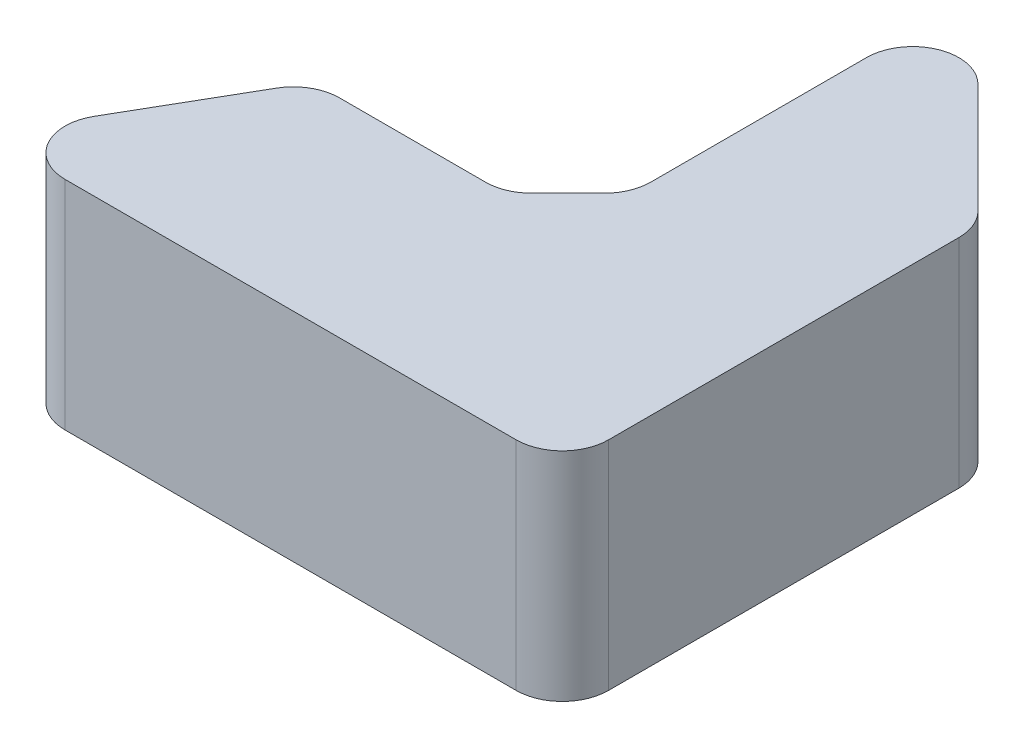
ISO-10303-21;
HEADER;
FILE_DESCRIPTION(('STEP AP214'),'2;1');
FILE_NAME('part.step','',(''),(''),'','','');
FILE_SCHEMA(('AUTOMOTIVE_DESIGN { 1 0 10303 214 1 1 1 1 }'));
ENDSEC;
DATA;
#1=APPLICATION_CONTEXT('core data for automotive mechanical design processes');
#2=APPLICATION_PROTOCOL_DEFINITION('international standard','automotive_design',2000,#1);
#3=PRODUCT_CONTEXT('',#1,'mechanical');
#4=PRODUCT('Part','Part','',(#3));
#5=PRODUCT_RELATED_PRODUCT_CATEGORY('part','',(#4));
#6=PRODUCT_DEFINITION_FORMATION('','',#4);
#7=PRODUCT_DEFINITION_CONTEXT('part definition',#1,'design');
#8=PRODUCT_DEFINITION('design','',#6,#7);
#9=PRODUCT_DEFINITION_SHAPE('','',#8);
#10=(LENGTH_UNIT() NAMED_UNIT(*) SI_UNIT(.MILLI.,.METRE.));
#11=(NAMED_UNIT(*) PLANE_ANGLE_UNIT() SI_UNIT($,.RADIAN.));
#12=(NAMED_UNIT(*) SI_UNIT($,.STERADIAN.) SOLID_ANGLE_UNIT());
#13=UNCERTAINTY_MEASURE_WITH_UNIT(LENGTH_MEASURE(1.E-05),#10,'distance_accuracy_value','');
#14=(GEOMETRIC_REPRESENTATION_CONTEXT(3) GLOBAL_UNCERTAINTY_ASSIGNED_CONTEXT((#13)) GLOBAL_UNIT_ASSIGNED_CONTEXT((#10,
#11,#12)) REPRESENTATION_CONTEXT('',''));
#15=CARTESIAN_POINT('',(0.,0.,0.));
#16=DIRECTION('',(0.,0.,1.));
#17=DIRECTION('',(1.,0.,0.));
#18=AXIS2_PLACEMENT_3D('',#15,#16,#17);
#19=CARTESIAN_POINT('',(10.3923048454134,18.8,-18.));
#20=DIRECTION('',(0.866025403784436,0.,0.500000000000004));
#21=DIRECTION('',(0.500000000000004,0.,-0.866025403784436));
#22=AXIS2_PLACEMENT_3D('',#19,#20,#21);
#23=PLANE('',#22);
#24=DIRECTION('',(-0.500000000000004,0.,0.866025403784436));
#25=VECTOR('',#24,1.);
#26=CARTESIAN_POINT('',(10.3923048454134,18.8,-18.));
#27=LINE('',#26,#25);
#28=CARTESIAN_POINT('',(9.23760430703412,18.8,-16.));
#29=VERTEX_POINT('',#28);
#30=CARTESIAN_POINT('',(3.4641016151378,18.8,-6.00000000000002));
#31=VERTEX_POINT('',#30);
#32=EDGE_CURVE('E192',#29,#31,#27,.T.);
#33=ORIENTED_EDGE('',*,*,#32,.F.);
#34=DIRECTION('',(0.,-1.,0.));
#35=VECTOR('',#34,1.);
#36=CARTESIAN_POINT('',(9.23760430703412,18.8,-16.));
#37=LINE('',#36,#35);
#38=CARTESIAN_POINT('',(9.23760430703412,0.,-16.));
#39=VERTEX_POINT('',#38);
#40=EDGE_CURVE('E256',#29,#39,#37,.T.);
#41=ORIENTED_EDGE('',*,*,#40,.T.);
#42=DIRECTION('',(-0.500000000000004,0.,0.866025403784436));
#43=VECTOR('',#42,1.);
#44=CARTESIAN_POINT('',(10.3923048454134,0.,-18.));
#45=LINE('',#44,#43);
#46=CARTESIAN_POINT('',(3.4641016151378,0.,-6.00000000000002));
#47=VERTEX_POINT('',#46);
#48=EDGE_CURVE('E178',#39,#47,#45,.T.);
#49=ORIENTED_EDGE('',*,*,#48,.T.);
#50=DIRECTION('',(0.,-1.,0.));
#51=VECTOR('',#50,1.);
#52=CARTESIAN_POINT('',(3.4641016151378,18.8,-6.00000000000001));
#53=LINE('',#52,#51);
#54=EDGE_CURVE('E253',#47,#31,#53,.F.);
#55=ORIENTED_EDGE('',*,*,#54,.T.);
#56=EDGE_LOOP('',(#33,#41,#49,#55));
#57=FACE_BOUND('',#56,.T.);
#58=ADVANCED_FACE('F39',(#57),#23,.F.);
#59=CARTESIAN_POINT('',(0.,18.8,0.));
#60=DIRECTION('',(0.,0.,-1.));
#61=DIRECTION('',(-1.,0.,0.));
#62=AXIS2_PLACEMENT_3D('',#59,#60,#61);
#63=PLANE('',#62);
#64=DIRECTION('',(1.,0.,0.));
#65=VECTOR('',#64,1.);
#66=CARTESIAN_POINT('',(0.,0.,0.));
#67=LINE('',#66,#65);
#68=CARTESIAN_POINT('',(6.92820323027555,0.,0.));
#69=VERTEX_POINT('',#68);
#70=CARTESIAN_POINT('',(46.,0.,0.));
#71=VERTEX_POINT('',#70);
#72=EDGE_CURVE('E171',#69,#71,#67,.T.);
#73=ORIENTED_EDGE('',*,*,#72,.T.);
#74=DIRECTION('',(0.,-1.,0.));
#75=VECTOR('',#74,1.);
#76=CARTESIAN_POINT('',(46.,18.8,0.));
#77=LINE('',#76,#75);
#78=CARTESIAN_POINT('',(46.,18.8,0.));
#79=VERTEX_POINT('',#78);
#80=EDGE_CURVE('E146',#71,#79,#77,.F.);
#81=ORIENTED_EDGE('',*,*,#80,.T.);
#82=DIRECTION('',(1.,0.,0.));
#83=VECTOR('',#82,1.);
#84=CARTESIAN_POINT('',(0.,18.8,0.));
#85=LINE('',#84,#83);
#86=CARTESIAN_POINT('',(6.92820323027555,18.8,0.));
#87=VERTEX_POINT('',#86);
#88=EDGE_CURVE('E299',#87,#79,#85,.T.);
#89=ORIENTED_EDGE('',*,*,#88,.F.);
#90=DIRECTION('',(0.,-1.,0.));
#91=VECTOR('',#90,1.);
#92=CARTESIAN_POINT('',(6.92820323027555,18.8,0.));
#93=LINE('',#92,#91);
#94=EDGE_CURVE('E152',#87,#69,#93,.T.);
#95=ORIENTED_EDGE('',*,*,#94,.T.);
#96=EDGE_LOOP('',(#73,#81,#89,#95));
#97=FACE_BOUND('',#96,.T.);
#98=ADVANCED_FACE('F301',(#97),#63,.F.);
#99=CARTESIAN_POINT('',(50.,18.8,0.));
#100=DIRECTION('',(-1.,0.,0.));
#101=DIRECTION('',(0.,0.,1.));
#102=AXIS2_PLACEMENT_3D('',#99,#100,#101);
#103=PLANE('',#102);
#104=DIRECTION('',(0.,0.,-1.));
#105=VECTOR('',#104,1.);
#106=CARTESIAN_POINT('',(50.,18.8,0.));
#107=LINE('',#106,#105);
#108=CARTESIAN_POINT('',(50.,18.8,-4.));
#109=VERTEX_POINT('',#108);
#110=CARTESIAN_POINT('',(50.,18.8,-34.3431457505076));
#111=VERTEX_POINT('',#110);
#112=EDGE_CURVE('E162',#109,#111,#107,.T.);
#113=ORIENTED_EDGE('',*,*,#112,.F.);
#114=DIRECTION('',(0.,-1.,0.));
#115=VECTOR('',#114,1.);
#116=CARTESIAN_POINT('',(50.,18.8,-4.));
#117=LINE('',#116,#115);
#118=CARTESIAN_POINT('',(50.,0.,-4.));
#119=VERTEX_POINT('',#118);
#120=EDGE_CURVE('E145',#109,#119,#117,.T.);
#121=ORIENTED_EDGE('',*,*,#120,.T.);
#122=DIRECTION('',(0.,0.,-1.));
#123=VECTOR('',#122,1.);
#124=CARTESIAN_POINT('',(50.,0.,0.));
#125=LINE('',#124,#123);
#126=CARTESIAN_POINT('',(50.,0.,-34.3431457505076));
#127=VERTEX_POINT('',#126);
#128=EDGE_CURVE('E159',#119,#127,#125,.T.);
#129=ORIENTED_EDGE('',*,*,#128,.T.);
#130=DIRECTION('',(0.,-1.,0.));
#131=VECTOR('',#130,1.);
#132=CARTESIAN_POINT('',(50.,18.8,-34.3431457505076));
#133=LINE('',#132,#131);
#134=EDGE_CURVE('E165',#127,#111,#133,.F.);
#135=ORIENTED_EDGE('',*,*,#134,.T.);
#136=EDGE_LOOP('',(#113,#121,#129,#135));
#137=FACE_BOUND('',#136,.T.);
#138=ADVANCED_FACE('F158',(#137),#103,.F.);
#139=CARTESIAN_POINT('',(50.,18.8,-36.));
#140=DIRECTION('',(-0.707106781186546,0.,0.707106781186549));
#141=DIRECTION('',(0.707106781186549,0.,0.707106781186546));
#142=AXIS2_PLACEMENT_3D('',#139,#140,#141);
#143=PLANE('',#142);
#144=DIRECTION('',(-0.707106781186549,0.,-0.707106781186546));
#145=VECTOR('',#144,1.);
#146=CARTESIAN_POINT('',(50.,18.8,-36.));
#147=LINE('',#146,#145);
#148=CARTESIAN_POINT('',(48.8284271247462,18.8,-37.1715728752538));
#149=VERTEX_POINT('',#148);
#150=CARTESIAN_POINT('',(39.3284271247462,18.8,-46.6715728752538));
#151=VERTEX_POINT('',#150);
#152=EDGE_CURVE('E306',#149,#151,#147,.T.);
#153=ORIENTED_EDGE('',*,*,#152,.F.);
#154=DIRECTION('',(0.,-1.,0.));
#155=VECTOR('',#154,1.);
#156=CARTESIAN_POINT('',(48.8284271247462,18.8,-37.1715728752538));
#157=LINE('',#156,#155);
#158=CARTESIAN_POINT('',(48.8284271247462,0.,-37.1715728752538));
#159=VERTEX_POINT('',#158);
#160=EDGE_CURVE('E229',#149,#159,#157,.T.);
#161=ORIENTED_EDGE('',*,*,#160,.T.);
#162=DIRECTION('',(-0.707106781186549,0.,-0.707106781186546));
#163=VECTOR('',#162,1.);
#164=CARTESIAN_POINT('',(50.,0.,-36.));
#165=LINE('',#164,#163);
#166=CARTESIAN_POINT('',(39.3284271247462,0.,-46.6715728752538));
#167=VERTEX_POINT('',#166);
#168=EDGE_CURVE('E170',#159,#167,#165,.T.);
#169=ORIENTED_EDGE('',*,*,#168,.T.);
#170=DIRECTION('',(0.,-1.,0.));
#171=VECTOR('',#170,1.);
#172=CARTESIAN_POINT('',(39.3284271247462,18.8,-46.6715728752538));
#173=LINE('',#172,#171);
#174=EDGE_CURVE('E226',#167,#151,#173,.F.);
#175=ORIENTED_EDGE('',*,*,#174,.T.);
#176=EDGE_LOOP('',(#153,#161,#169,#175));
#177=FACE_BOUND('',#176,.T.);
#178=ADVANCED_FACE('F329',(#177),#143,.F.);
#179=CARTESIAN_POINT('',(32.5,18.8,-53.4999999999999));
#180=DIRECTION('',(1.,0.,0.));
#181=DIRECTION('',(0.,0.,-1.));
#182=AXIS2_PLACEMENT_3D('',#179,#180,#181);
#183=PLANE('',#182);
#184=DIRECTION('',(0.,0.,1.));
#185=VECTOR('',#184,1.);
#186=CARTESIAN_POINT('',(32.5,18.8,-53.4999999999999));
#187=LINE('',#186,#185);
#188=CARTESIAN_POINT('',(32.5,18.8,-43.8431457505076));
#189=VERTEX_POINT('',#188);
#190=CARTESIAN_POINT('',(32.5,18.8,-25.1568542494923));
#191=VERTEX_POINT('',#190);
#192=EDGE_CURVE('E282',#189,#191,#187,.T.);
#193=ORIENTED_EDGE('',*,*,#192,.F.);
#194=DIRECTION('',(0.,-1.,0.));
#195=VECTOR('',#194,1.);
#196=CARTESIAN_POINT('',(32.5,18.8,-43.8431457505076));
#197=LINE('',#196,#195);
#198=CARTESIAN_POINT('',(32.5,0.,-43.8431457505076));
#199=VERTEX_POINT('',#198);
#200=EDGE_CURVE('E236',#189,#199,#197,.T.);
#201=ORIENTED_EDGE('',*,*,#200,.T.);
#202=DIRECTION('',(0.,0.,1.));
#203=VECTOR('',#202,1.);
#204=CARTESIAN_POINT('',(32.5,0.,-53.4999999999999));
#205=LINE('',#204,#203);
#206=CARTESIAN_POINT('',(32.5,0.,-25.1568542494923));
#207=VERTEX_POINT('',#206);
#208=EDGE_CURVE('E176',#199,#207,#205,.T.);
#209=ORIENTED_EDGE('',*,*,#208,.T.);
#210=DIRECTION('',(0.,-1.,0.));
#211=VECTOR('',#210,1.);
#212=CARTESIAN_POINT('',(32.5,18.8,-25.1568542494923));
#213=LINE('',#212,#211);
#214=EDGE_CURVE('E233',#207,#191,#213,.F.);
#215=ORIENTED_EDGE('',*,*,#214,.T.);
#216=EDGE_LOOP('',(#193,#201,#209,#215));
#217=FACE_BOUND('',#216,.T.);
#218=ADVANCED_FACE('F323',(#217),#183,.F.);
#219=CARTESIAN_POINT('',(32.5,18.8,-23.4999999999999));
#220=DIRECTION('',(0.707106781186549,0.,0.707106781186546));
#221=DIRECTION('',(0.707106781186546,0.,-0.707106781186549));
#222=AXIS2_PLACEMENT_3D('',#219,#220,#221);
#223=PLANE('',#222);
#224=DIRECTION('',(-0.707106781186546,0.,0.707106781186549));
#225=VECTOR('',#224,1.);
#226=CARTESIAN_POINT('',(32.5,18.8,-23.4999999999999));
#227=LINE('',#226,#225);
#228=CARTESIAN_POINT('',(31.3284271247462,18.8,-22.3284271247461));
#229=VERTEX_POINT('',#228);
#230=CARTESIAN_POINT('',(28.1715728752539,18.8,-19.1715728752538));
#231=VERTEX_POINT('',#230);
#232=EDGE_CURVE('E279',#229,#231,#227,.T.);
#233=ORIENTED_EDGE('',*,*,#232,.F.);
#234=DIRECTION('',(0.,-1.,0.));
#235=VECTOR('',#234,1.);
#236=CARTESIAN_POINT('',(31.3284271247462,0.,-22.3284271247461));
#237=LINE('',#236,#235);
#238=CARTESIAN_POINT('',(31.3284271247462,0.,-22.3284271247461));
#239=VERTEX_POINT('',#238);
#240=EDGE_CURVE('E243',#229,#239,#237,.T.);
#241=ORIENTED_EDGE('',*,*,#240,.T.);
#242=DIRECTION('',(-0.707106781186546,0.,0.707106781186549));
#243=VECTOR('',#242,1.);
#244=CARTESIAN_POINT('',(32.5,0.,-23.4999999999999));
#245=LINE('',#244,#243);
#246=CARTESIAN_POINT('',(28.1715728752539,0.,-19.1715728752538));
#247=VERTEX_POINT('',#246);
#248=EDGE_CURVE('E185',#239,#247,#245,.T.);
#249=ORIENTED_EDGE('',*,*,#248,.T.);
#250=DIRECTION('',(0.,-1.,0.));
#251=VECTOR('',#250,1.);
#252=CARTESIAN_POINT('',(28.1715728752539,18.8,-19.1715728752538));
#253=LINE('',#252,#251);
#254=EDGE_CURVE('E240',#247,#231,#253,.F.);
#255=ORIENTED_EDGE('',*,*,#254,.T.);
#256=EDGE_LOOP('',(#233,#241,#249,#255));
#257=FACE_BOUND('',#256,.T.);
#258=ADVANCED_FACE('F273',(#257),#223,.F.);
#259=CARTESIAN_POINT('',(27.0000000000001,18.8,-18.));
#260=DIRECTION('',(0.,0.,1.));
#261=DIRECTION('',(1.,0.,0.));
#262=AXIS2_PLACEMENT_3D('',#259,#260,#261);
#263=PLANE('',#262);
#264=DIRECTION('',(-1.,0.,0.));
#265=VECTOR('',#264,1.);
#266=CARTESIAN_POINT('',(27.0000000000001,18.8,-18.));
#267=LINE('',#266,#265);
#268=CARTESIAN_POINT('',(25.3431457505077,18.8,-18.));
#269=VERTEX_POINT('',#268);
#270=CARTESIAN_POINT('',(12.7017059221719,18.8,-18.));
#271=VERTEX_POINT('',#270);
#272=EDGE_CURVE('E194',#269,#271,#267,.T.);
#273=ORIENTED_EDGE('',*,*,#272,.F.);
#274=DIRECTION('',(0.,-1.,0.));
#275=VECTOR('',#274,1.);
#276=CARTESIAN_POINT('',(25.3431457505077,0.,-18.));
#277=LINE('',#276,#275);
#278=CARTESIAN_POINT('',(25.3431457505077,0.,-18.));
#279=VERTEX_POINT('',#278);
#280=EDGE_CURVE('E249',#269,#279,#277,.T.);
#281=ORIENTED_EDGE('',*,*,#280,.T.);
#282=DIRECTION('',(-1.,0.,0.));
#283=VECTOR('',#282,1.);
#284=CARTESIAN_POINT('',(27.0000000000001,0.,-18.));
#285=LINE('',#284,#283);
#286=CARTESIAN_POINT('',(12.7017059221719,0.,-18.));
#287=VERTEX_POINT('',#286);
#288=EDGE_CURVE('E189',#279,#287,#285,.T.);
#289=ORIENTED_EDGE('',*,*,#288,.T.);
#290=DIRECTION('',(0.,-1.,0.));
#291=VECTOR('',#290,1.);
#292=CARTESIAN_POINT('',(12.7017059221719,18.8,-18.));
#293=LINE('',#292,#291);
#294=EDGE_CURVE('E55',#287,#271,#293,.F.);
#295=ORIENTED_EDGE('',*,*,#294,.T.);
#296=EDGE_LOOP('',(#273,#281,#289,#295));
#297=FACE_BOUND('',#296,.T.);
#298=ADVANCED_FACE('F276',(#297),#263,.F.);
#299=CARTESIAN_POINT('',(0.,18.8,0.));
#300=DIRECTION('',(0.,-1.,0.));
#301=DIRECTION('',(0.,0.,-1.));
#302=AXIS2_PLACEMENT_3D('',#299,#300,#301);
#303=PLANE('',#302);
#304=ORIENTED_EDGE('',*,*,#88,.T.);
#305=CARTESIAN_POINT('',(46.,18.8,-4.));
#306=DIRECTION('',(0.,-1.,0.));
#307=DIRECTION('',(0.,0.,-1.));
#308=AXIS2_PLACEMENT_3D('',#305,#306,#307);
#309=CIRCLE('',#308,4.);
#310=EDGE_CURVE('E223',#79,#109,#309,.F.);
#311=ORIENTED_EDGE('',*,*,#310,.T.);
#312=ORIENTED_EDGE('',*,*,#112,.T.);
#313=CARTESIAN_POINT('',(46.,18.8,-34.3431457505076));
#314=DIRECTION('',(0.,-1.,0.));
#315=DIRECTION('',(0.,0.,-1.));
#316=AXIS2_PLACEMENT_3D('',#313,#314,#315);
#317=CIRCLE('',#316,4.);
#318=EDGE_CURVE('E220',#111,#149,#317,.F.);
#319=ORIENTED_EDGE('',*,*,#318,.T.);
#320=ORIENTED_EDGE('',*,*,#152,.T.);
#321=CARTESIAN_POINT('',(36.5,18.8,-43.8431457505076));
#322=DIRECTION('',(0.,-1.,0.));
#323=DIRECTION('',(0.,0.,-1.));
#324=AXIS2_PLACEMENT_3D('',#321,#322,#323);
#325=CIRCLE('',#324,4.);
#326=EDGE_CURVE('E217',#151,#189,#325,.F.);
#327=ORIENTED_EDGE('',*,*,#326,.T.);
#328=ORIENTED_EDGE('',*,*,#192,.T.);
#329=CARTESIAN_POINT('',(28.5,18.8,-25.1568542494923));
#330=DIRECTION('',(0.,-1.,0.));
#331=DIRECTION('',(0.,0.,-1.));
#332=AXIS2_PLACEMENT_3D('',#329,#330,#331);
#333=CIRCLE('',#332,4.);
#334=EDGE_CURVE('E263',#191,#229,#333,.T.);
#335=ORIENTED_EDGE('',*,*,#334,.T.);
#336=ORIENTED_EDGE('',*,*,#232,.T.);
#337=CARTESIAN_POINT('',(25.3431457505077,18.8,-22.));
#338=DIRECTION('',(0.,-1.,0.));
#339=DIRECTION('',(0.,0.,-1.));
#340=AXIS2_PLACEMENT_3D('',#337,#338,#339);
#341=CIRCLE('',#340,4.);
#342=EDGE_CURVE('E11',#231,#269,#341,.T.);
#343=ORIENTED_EDGE('',*,*,#342,.T.);
#344=ORIENTED_EDGE('',*,*,#272,.T.);
#345=CARTESIAN_POINT('',(12.7017059221719,18.8,-14.));
#346=DIRECTION('',(0.,-1.,0.));
#347=DIRECTION('',(0.,0.,-1.));
#348=AXIS2_PLACEMENT_3D('',#345,#346,#347);
#349=CIRCLE('',#348,4.);
#350=EDGE_CURVE('E214',#271,#29,#349,.F.);
#351=ORIENTED_EDGE('',*,*,#350,.T.);
#352=ORIENTED_EDGE('',*,*,#32,.T.);
#353=CARTESIAN_POINT('',(6.92820323027555,18.8,-4.));
#354=DIRECTION('',(0.,-1.,0.));
#355=DIRECTION('',(0.,0.,-1.));
#356=AXIS2_PLACEMENT_3D('',#353,#354,#355);
#357=CIRCLE('',#356,4.);
#358=EDGE_CURVE('E211',#31,#87,#357,.F.);
#359=ORIENTED_EDGE('',*,*,#358,.T.);
#360=EDGE_LOOP('',(#304,#311,#312,#319,#320,#327,#328,#335,#336,#343,#344,#351,#352,#359));
#361=FACE_BOUND('',#360,.T.);
#362=ADVANCED_FACE('F298',(#361),#303,.F.);
#363=CARTESIAN_POINT('',(0.,0.,0.));
#364=DIRECTION('',(0.,-1.,0.));
#365=DIRECTION('',(0.,0.,-1.));
#366=AXIS2_PLACEMENT_3D('',#363,#364,#365);
#367=PLANE('',#366);
#368=ORIENTED_EDGE('',*,*,#128,.F.);
#369=CARTESIAN_POINT('',(46.,0.,-4.));
#370=DIRECTION('',(0.,-1.,0.));
#371=DIRECTION('',(0.,0.,-1.));
#372=AXIS2_PLACEMENT_3D('',#369,#370,#371);
#373=CIRCLE('',#372,4.);
#374=EDGE_CURVE('E141',#119,#71,#373,.T.);
#375=ORIENTED_EDGE('',*,*,#374,.T.);
#376=ORIENTED_EDGE('',*,*,#72,.F.);
#377=CARTESIAN_POINT('',(6.92820323027555,0.,-4.));
#378=DIRECTION('',(0.,-1.,0.));
#379=DIRECTION('',(0.,0.,-1.));
#380=AXIS2_PLACEMENT_3D('',#377,#378,#379);
#381=CIRCLE('',#380,4.);
#382=EDGE_CURVE('E164',#69,#47,#381,.T.);
#383=ORIENTED_EDGE('',*,*,#382,.T.);
#384=ORIENTED_EDGE('',*,*,#48,.F.);
#385=CARTESIAN_POINT('',(12.7017059221719,0.,-14.));
#386=DIRECTION('',(0.,-1.,0.));
#387=DIRECTION('',(0.,0.,-1.));
#388=AXIS2_PLACEMENT_3D('',#385,#386,#387);
#389=CIRCLE('',#388,4.);
#390=EDGE_CURVE('E198',#39,#287,#389,.T.);
#391=ORIENTED_EDGE('',*,*,#390,.T.);
#392=ORIENTED_EDGE('',*,*,#288,.F.);
#393=CARTESIAN_POINT('',(25.3431457505077,0.,-22.));
#394=DIRECTION('',(0.,-1.,0.));
#395=DIRECTION('',(0.,0.,-1.));
#396=AXIS2_PLACEMENT_3D('',#393,#394,#395);
#397=CIRCLE('',#396,4.);
#398=EDGE_CURVE('E48',#279,#247,#397,.F.);
#399=ORIENTED_EDGE('',*,*,#398,.T.);
#400=ORIENTED_EDGE('',*,*,#248,.F.);
#401=CARTESIAN_POINT('',(28.5,0.,-25.1568542494923));
#402=DIRECTION('',(0.,-1.,0.));
#403=DIRECTION('',(0.,0.,-1.));
#404=AXIS2_PLACEMENT_3D('',#401,#402,#403);
#405=CIRCLE('',#404,4.);
#406=EDGE_CURVE('E260',#239,#207,#405,.F.);
#407=ORIENTED_EDGE('',*,*,#406,.T.);
#408=ORIENTED_EDGE('',*,*,#208,.F.);
#409=CARTESIAN_POINT('',(36.5,0.,-43.8431457505076));
#410=DIRECTION('',(0.,-1.,0.));
#411=DIRECTION('',(0.,0.,-1.));
#412=AXIS2_PLACEMENT_3D('',#409,#410,#411);
#413=CIRCLE('',#412,4.);
#414=EDGE_CURVE('E201',#199,#167,#413,.T.);
#415=ORIENTED_EDGE('',*,*,#414,.T.);
#416=ORIENTED_EDGE('',*,*,#168,.F.);
#417=CARTESIAN_POINT('',(46.,0.,-34.3431457505076));
#418=DIRECTION('',(0.,-1.,0.));
#419=DIRECTION('',(0.,0.,-1.));
#420=AXIS2_PLACEMENT_3D('',#417,#418,#419);
#421=CIRCLE('',#420,4.);
#422=EDGE_CURVE('E153',#159,#127,#421,.T.);
#423=ORIENTED_EDGE('',*,*,#422,.T.);
#424=EDGE_LOOP('',(#368,#375,#376,#383,#384,#391,#392,#399,#400,#407,#408,#415,#416,#423));
#425=FACE_BOUND('',#424,.T.);
#426=ADVANCED_FACE('F167',(#425),#367,.T.);
#427=CARTESIAN_POINT('',(46.,18.8,-4.));
#428=DIRECTION('',(0.,-1.,0.));
#429=DIRECTION('',(0.,0.,-1.));
#430=AXIS2_PLACEMENT_3D('',#427,#428,#429);
#431=CYLINDRICAL_SURFACE('',#430,4.);
#432=ORIENTED_EDGE('',*,*,#310,.F.);
#433=ORIENTED_EDGE('',*,*,#80,.F.);
#434=ORIENTED_EDGE('',*,*,#374,.F.);
#435=ORIENTED_EDGE('',*,*,#120,.F.);
#436=EDGE_LOOP('',(#432,#433,#434,#435));
#437=FACE_BOUND('',#436,.T.);
#438=ADVANCED_FACE('F144',(#437),#431,.T.);
#439=CARTESIAN_POINT('',(46.,18.8,-34.3431457505076));
#440=DIRECTION('',(0.,-1.,0.));
#441=DIRECTION('',(0.,0.,-1.));
#442=AXIS2_PLACEMENT_3D('',#439,#440,#441);
#443=CYLINDRICAL_SURFACE('',#442,4.);
#444=ORIENTED_EDGE('',*,*,#318,.F.);
#445=ORIENTED_EDGE('',*,*,#134,.F.);
#446=ORIENTED_EDGE('',*,*,#422,.F.);
#447=ORIENTED_EDGE('',*,*,#160,.F.);
#448=EDGE_LOOP('',(#444,#445,#446,#447));
#449=FACE_BOUND('',#448,.T.);
#450=ADVANCED_FACE('F333',(#449),#443,.T.);
#451=CARTESIAN_POINT('',(36.5,18.8,-43.8431457505076));
#452=DIRECTION('',(0.,-1.,0.));
#453=DIRECTION('',(0.,0.,-1.));
#454=AXIS2_PLACEMENT_3D('',#451,#452,#453);
#455=CYLINDRICAL_SURFACE('',#454,4.);
#456=ORIENTED_EDGE('',*,*,#326,.F.);
#457=ORIENTED_EDGE('',*,*,#174,.F.);
#458=ORIENTED_EDGE('',*,*,#414,.F.);
#459=ORIENTED_EDGE('',*,*,#200,.F.);
#460=EDGE_LOOP('',(#456,#457,#458,#459));
#461=FACE_BOUND('',#460,.T.);
#462=ADVANCED_FACE('F325',(#461),#455,.T.);
#463=CARTESIAN_POINT('',(28.5,18.8,-25.1568542494923));
#464=DIRECTION('',(0.,1.,0.));
#465=DIRECTION('',(0.,0.,1.));
#466=AXIS2_PLACEMENT_3D('',#463,#464,#465);
#467=CYLINDRICAL_SURFACE('',#466,4.);
#468=ORIENTED_EDGE('',*,*,#334,.F.);
#469=ORIENTED_EDGE('',*,*,#214,.F.);
#470=ORIENTED_EDGE('',*,*,#406,.F.);
#471=ORIENTED_EDGE('',*,*,#240,.F.);
#472=EDGE_LOOP('',(#468,#469,#470,#471));
#473=FACE_BOUND('',#472,.T.);
#474=ADVANCED_FACE('F321',(#473),#467,.F.);
#475=CARTESIAN_POINT('',(25.3431457505077,18.8,-22.));
#476=DIRECTION('',(0.,1.,0.));
#477=DIRECTION('',(0.,0.,1.));
#478=AXIS2_PLACEMENT_3D('',#475,#476,#477);
#479=CYLINDRICAL_SURFACE('',#478,4.);
#480=ORIENTED_EDGE('',*,*,#342,.F.);
#481=ORIENTED_EDGE('',*,*,#254,.F.);
#482=ORIENTED_EDGE('',*,*,#398,.F.);
#483=ORIENTED_EDGE('',*,*,#280,.F.);
#484=EDGE_LOOP('',(#480,#481,#482,#483));
#485=FACE_BOUND('',#484,.T.);
#486=ADVANCED_FACE('F275',(#485),#479,.F.);
#487=CARTESIAN_POINT('',(12.7017059221719,18.8,-14.));
#488=DIRECTION('',(0.,-1.,0.));
#489=DIRECTION('',(0.,0.,-1.));
#490=AXIS2_PLACEMENT_3D('',#487,#488,#489);
#491=CYLINDRICAL_SURFACE('',#490,4.);
#492=ORIENTED_EDGE('',*,*,#350,.F.);
#493=ORIENTED_EDGE('',*,*,#294,.F.);
#494=ORIENTED_EDGE('',*,*,#390,.F.);
#495=ORIENTED_EDGE('',*,*,#40,.F.);
#496=EDGE_LOOP('',(#492,#493,#494,#495));
#497=FACE_BOUND('',#496,.T.);
#498=ADVANCED_FACE('F401',(#497),#491,.T.);
#499=CARTESIAN_POINT('',(6.92820323027555,18.8,-4.));
#500=DIRECTION('',(0.,-1.,0.));
#501=DIRECTION('',(0.,0.,-1.));
#502=AXIS2_PLACEMENT_3D('',#499,#500,#501);
#503=CYLINDRICAL_SURFACE('',#502,4.);
#504=ORIENTED_EDGE('',*,*,#358,.F.);
#505=ORIENTED_EDGE('',*,*,#54,.F.);
#506=ORIENTED_EDGE('',*,*,#382,.F.);
#507=ORIENTED_EDGE('',*,*,#94,.F.);
#508=EDGE_LOOP('',(#504,#505,#506,#507));
#509=FACE_BOUND('',#508,.T.);
#510=ADVANCED_FACE('F41',(#509),#503,.T.);
#511=CLOSED_SHELL('',(#58,#98,#138,#178,#218,#258,#298,#362,#426,#438,#450,#462,#474,#486,#498,#510));
#512=MANIFOLD_SOLID_BREP('B2',#511);
#513=ADVANCED_BREP_SHAPE_REPRESENTATION('',(#18,#512),#14);
#514=SHAPE_DEFINITION_REPRESENTATION(#9,#513);
ENDSEC;
END-ISO-10303-21;
